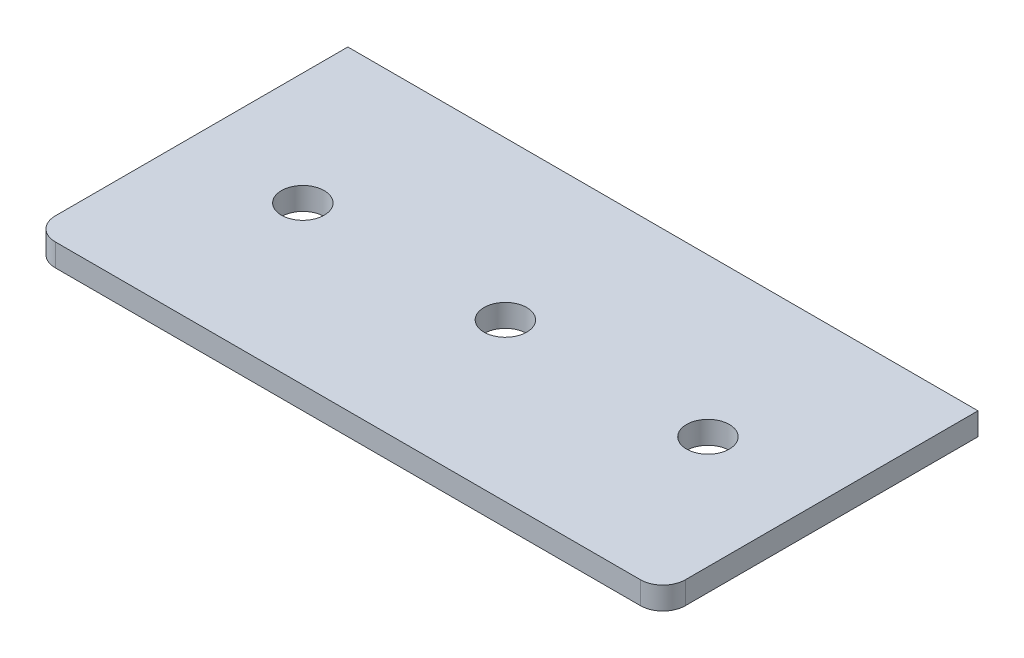
ISO-10303-21;
HEADER;
FILE_DESCRIPTION(('STEP AP214'),'2;1');
FILE_NAME('part.step','',(''),(''),'','','');
FILE_SCHEMA(('AUTOMOTIVE_DESIGN { 1 0 10303 214 1 1 1 1 }'));
ENDSEC;
DATA;
#1=APPLICATION_CONTEXT('core data for automotive mechanical design processes');
#2=APPLICATION_PROTOCOL_DEFINITION('international standard','automotive_design',2000,#1);
#3=PRODUCT_CONTEXT('',#1,'mechanical');
#4=PRODUCT('Part','Part','',(#3));
#5=PRODUCT_RELATED_PRODUCT_CATEGORY('part','',(#4));
#6=PRODUCT_DEFINITION_FORMATION('','',#4);
#7=PRODUCT_DEFINITION_CONTEXT('part definition',#1,'design');
#8=PRODUCT_DEFINITION('design','',#6,#7);
#9=PRODUCT_DEFINITION_SHAPE('','',#8);
#10=(LENGTH_UNIT() NAMED_UNIT(*) SI_UNIT(.MILLI.,.METRE.));
#11=(NAMED_UNIT(*) PLANE_ANGLE_UNIT() SI_UNIT($,.RADIAN.));
#12=(NAMED_UNIT(*) SI_UNIT($,.STERADIAN.) SOLID_ANGLE_UNIT());
#13=UNCERTAINTY_MEASURE_WITH_UNIT(LENGTH_MEASURE(1.E-05),#10,'distance_accuracy_value','');
#14=(GEOMETRIC_REPRESENTATION_CONTEXT(3) GLOBAL_UNCERTAINTY_ASSIGNED_CONTEXT((#13)) GLOBAL_UNIT_ASSIGNED_CONTEXT((#10,
#11,#12)) REPRESENTATION_CONTEXT('',''));
#15=CARTESIAN_POINT('',(0.,0.,0.));
#16=DIRECTION('',(0.,0.,1.));
#17=DIRECTION('',(1.,0.,0.));
#18=AXIS2_PLACEMENT_3D('',#15,#16,#17);
#19=CARTESIAN_POINT('',(0.,10.,0.));
#20=DIRECTION('',(0.,-1.,0.));
#21=DIRECTION('',(0.,0.,-1.));
#22=AXIS2_PLACEMENT_3D('',#19,#20,#21);
#23=PLANE('',#22);
#24=CARTESIAN_POINT('',(-90.,10.,0.));
#25=DIRECTION('',(0.,1.,0.));
#26=DIRECTION('',(0.,0.,1.));
#27=AXIS2_PLACEMENT_3D('',#24,#25,#26);
#28=CIRCLE('',#27,9.49999999999999);
#29=CARTESIAN_POINT('',(-90.,10.,9.49999999999998));
#30=VERTEX_POINT('',#29);
#31=EDGE_CURVE('E154',#30,#30,#28,.T.);
#32=ORIENTED_EDGE('',*,*,#31,.F.);
#33=EDGE_LOOP('',(#32));
#34=FACE_BOUND('',#33,.T.);
#35=CARTESIAN_POINT('',(0.,10.,0.));
#36=DIRECTION('',(0.,1.,0.));
#37=DIRECTION('',(0.,0.,1.));
#38=AXIS2_PLACEMENT_3D('',#35,#36,#37);
#39=CIRCLE('',#38,9.5);
#40=CARTESIAN_POINT('',(0.,10.,9.5));
#41=VERTEX_POINT('',#40);
#42=EDGE_CURVE('E147',#41,#41,#39,.T.);
#43=ORIENTED_EDGE('',*,*,#42,.F.);
#44=EDGE_LOOP('',(#43));
#45=FACE_BOUND('',#44,.T.);
#46=DIRECTION('',(1.,0.,0.));
#47=VECTOR('',#46,1.);
#48=CARTESIAN_POINT('',(-140.,10.,70.));
#49=LINE('',#48,#47);
#50=CARTESIAN_POINT('',(-130.,10.,70.));
#51=VERTEX_POINT('',#50);
#52=CARTESIAN_POINT('',(130.,10.,70.));
#53=VERTEX_POINT('',#52);
#54=EDGE_CURVE('E116',#51,#53,#49,.T.);
#55=ORIENTED_EDGE('',*,*,#54,.T.);
#56=CARTESIAN_POINT('',(130.,10.,60.));
#57=DIRECTION('',(0.,-1.,0.));
#58=DIRECTION('',(0.,0.,-1.));
#59=AXIS2_PLACEMENT_3D('',#56,#57,#58);
#60=CIRCLE('',#59,10.);
#61=CARTESIAN_POINT('',(140.,10.,60.));
#62=VERTEX_POINT('',#61);
#63=EDGE_CURVE('E42',#53,#62,#60,.F.);
#64=ORIENTED_EDGE('',*,*,#63,.T.);
#65=DIRECTION('',(0.,0.,-1.));
#66=VECTOR('',#65,1.);
#67=CARTESIAN_POINT('',(140.,10.,70.));
#68=LINE('',#67,#66);
#69=CARTESIAN_POINT('',(140.,10.,-70.));
#70=VERTEX_POINT('',#69);
#71=EDGE_CURVE('E88',#62,#70,#68,.T.);
#72=ORIENTED_EDGE('',*,*,#71,.T.);
#73=DIRECTION('',(-1.,0.,0.));
#74=VECTOR('',#73,1.);
#75=CARTESIAN_POINT('',(-140.,10.,-70.));
#76=LINE('',#75,#74);
#77=CARTESIAN_POINT('',(-140.,10.,-70.));
#78=VERTEX_POINT('',#77);
#79=EDGE_CURVE('E91',#70,#78,#76,.T.);
#80=ORIENTED_EDGE('',*,*,#79,.T.);
#81=DIRECTION('',(0.,0.,1.));
#82=VECTOR('',#81,1.);
#83=CARTESIAN_POINT('',(-140.,10.,70.));
#84=LINE('',#83,#82);
#85=CARTESIAN_POINT('',(-140.,10.,60.));
#86=VERTEX_POINT('',#85);
#87=EDGE_CURVE('E106',#78,#86,#84,.T.);
#88=ORIENTED_EDGE('',*,*,#87,.T.);
#89=CARTESIAN_POINT('',(-130.,10.,60.));
#90=DIRECTION('',(0.,-1.,0.));
#91=DIRECTION('',(0.,0.,-1.));
#92=AXIS2_PLACEMENT_3D('',#89,#90,#91);
#93=CIRCLE('',#92,10.);
#94=EDGE_CURVE('E127',#86,#51,#93,.F.);
#95=ORIENTED_EDGE('',*,*,#94,.T.);
#96=EDGE_LOOP('',(#55,#64,#72,#80,#88,#95));
#97=FACE_BOUND('',#96,.T.);
#98=CARTESIAN_POINT('',(90.,10.,0.));
#99=DIRECTION('',(0.,-1.,0.));
#100=DIRECTION('',(0.,0.,1.));
#101=AXIS2_PLACEMENT_3D('',#98,#99,#100);
#102=CIRCLE('',#101,9.49999999999999);
#103=CARTESIAN_POINT('',(90.,10.,9.49999999999998));
#104=VERTEX_POINT('',#103);
#105=EDGE_CURVE('E159',#104,#104,#102,.T.);
#106=ORIENTED_EDGE('',*,*,#105,.T.);
#107=EDGE_LOOP('',(#106));
#108=FACE_BOUND('',#107,.T.);
#109=ADVANCED_FACE('F34',(#34,#45,#97,#108),#23,.F.);
#110=CARTESIAN_POINT('',(0.,0.,0.));
#111=DIRECTION('',(0.,-1.,0.));
#112=DIRECTION('',(0.,0.,-1.));
#113=AXIS2_PLACEMENT_3D('',#110,#111,#112);
#114=PLANE('',#113);
#115=DIRECTION('',(0.,0.,-1.));
#116=VECTOR('',#115,1.);
#117=CARTESIAN_POINT('',(140.,0.,70.));
#118=LINE('',#117,#116);
#119=CARTESIAN_POINT('',(140.,0.,60.));
#120=VERTEX_POINT('',#119);
#121=CARTESIAN_POINT('',(140.,0.,-70.));
#122=VERTEX_POINT('',#121);
#123=EDGE_CURVE('E110',#120,#122,#118,.T.);
#124=ORIENTED_EDGE('',*,*,#123,.F.);
#125=CARTESIAN_POINT('',(130.,0.,60.));
#126=DIRECTION('',(0.,-1.,0.));
#127=DIRECTION('',(0.,0.,-1.));
#128=AXIS2_PLACEMENT_3D('',#125,#126,#127);
#129=CIRCLE('',#128,10.);
#130=CARTESIAN_POINT('',(130.,0.,70.));
#131=VERTEX_POINT('',#130);
#132=EDGE_CURVE('E121',#120,#131,#129,.T.);
#133=ORIENTED_EDGE('',*,*,#132,.T.);
#134=DIRECTION('',(1.,0.,0.));
#135=VECTOR('',#134,1.);
#136=CARTESIAN_POINT('',(-140.,0.,70.));
#137=LINE('',#136,#135);
#138=CARTESIAN_POINT('',(-130.,0.,70.));
#139=VERTEX_POINT('',#138);
#140=EDGE_CURVE('E98',#139,#131,#137,.T.);
#141=ORIENTED_EDGE('',*,*,#140,.F.);
#142=CARTESIAN_POINT('',(-130.,0.,60.));
#143=DIRECTION('',(0.,-1.,0.));
#144=DIRECTION('',(0.,0.,-1.));
#145=AXIS2_PLACEMENT_3D('',#142,#143,#144);
#146=CIRCLE('',#145,10.);
#147=CARTESIAN_POINT('',(-140.,0.,60.));
#148=VERTEX_POINT('',#147);
#149=EDGE_CURVE('E114',#139,#148,#146,.T.);
#150=ORIENTED_EDGE('',*,*,#149,.T.);
#151=DIRECTION('',(0.,0.,1.));
#152=VECTOR('',#151,1.);
#153=CARTESIAN_POINT('',(-140.,0.,70.));
#154=LINE('',#153,#152);
#155=CARTESIAN_POINT('',(-140.,0.,-70.));
#156=VERTEX_POINT('',#155);
#157=EDGE_CURVE('E138',#156,#148,#154,.T.);
#158=ORIENTED_EDGE('',*,*,#157,.F.);
#159=DIRECTION('',(-1.,0.,0.));
#160=VECTOR('',#159,1.);
#161=CARTESIAN_POINT('',(-140.,0.,-70.));
#162=LINE('',#161,#160);
#163=EDGE_CURVE('E140',#122,#156,#162,.T.);
#164=ORIENTED_EDGE('',*,*,#163,.F.);
#165=EDGE_LOOP('',(#124,#133,#141,#150,#158,#164));
#166=FACE_BOUND('',#165,.T.);
#167=CARTESIAN_POINT('',(0.,0.,0.));
#168=DIRECTION('',(0.,1.,0.));
#169=DIRECTION('',(0.,0.,1.));
#170=AXIS2_PLACEMENT_3D('',#167,#168,#169);
#171=CIRCLE('',#170,9.5);
#172=CARTESIAN_POINT('',(0.,0.,9.5));
#173=VERTEX_POINT('',#172);
#174=EDGE_CURVE('E150',#173,#173,#171,.T.);
#175=ORIENTED_EDGE('',*,*,#174,.T.);
#176=EDGE_LOOP('',(#175));
#177=FACE_BOUND('',#176,.T.);
#178=CARTESIAN_POINT('',(-90.,0.,0.));
#179=DIRECTION('',(0.,1.,0.));
#180=DIRECTION('',(0.,0.,1.));
#181=AXIS2_PLACEMENT_3D('',#178,#179,#180);
#182=CIRCLE('',#181,9.49999999999999);
#183=CARTESIAN_POINT('',(-90.,0.,9.49999999999998));
#184=VERTEX_POINT('',#183);
#185=EDGE_CURVE('E144',#184,#184,#182,.T.);
#186=ORIENTED_EDGE('',*,*,#185,.T.);
#187=EDGE_LOOP('',(#186));
#188=FACE_BOUND('',#187,.T.);
#189=CARTESIAN_POINT('',(90.,0.,0.));
#190=DIRECTION('',(0.,-1.,0.));
#191=DIRECTION('',(0.,0.,1.));
#192=AXIS2_PLACEMENT_3D('',#189,#190,#191);
#193=CIRCLE('',#192,9.49999999999999);
#194=CARTESIAN_POINT('',(90.,0.,9.49999999999998));
#195=VERTEX_POINT('',#194);
#196=EDGE_CURVE('E151',#195,#195,#193,.T.);
#197=ORIENTED_EDGE('',*,*,#196,.F.);
#198=EDGE_LOOP('',(#197));
#199=FACE_BOUND('',#198,.T.);
#200=ADVANCED_FACE('F136',(#166,#177,#188,#199),#114,.T.);
#201=CARTESIAN_POINT('',(140.,10.,70.));
#202=DIRECTION('',(-1.,0.,0.));
#203=DIRECTION('',(0.,0.,1.));
#204=AXIS2_PLACEMENT_3D('',#201,#202,#203);
#205=PLANE('',#204);
#206=ORIENTED_EDGE('',*,*,#71,.F.);
#207=DIRECTION('',(0.,-1.,0.));
#208=VECTOR('',#207,1.);
#209=CARTESIAN_POINT('',(140.,10.,60.));
#210=LINE('',#209,#208);
#211=EDGE_CURVE('E112',#62,#120,#210,.T.);
#212=ORIENTED_EDGE('',*,*,#211,.T.);
#213=ORIENTED_EDGE('',*,*,#123,.T.);
#214=DIRECTION('',(0.,-1.,0.));
#215=VECTOR('',#214,1.);
#216=CARTESIAN_POINT('',(140.,10.,-70.));
#217=LINE('',#216,#215);
#218=EDGE_CURVE('E103',#70,#122,#217,.T.);
#219=ORIENTED_EDGE('',*,*,#218,.F.);
#220=EDGE_LOOP('',(#206,#212,#213,#219));
#221=FACE_BOUND('',#220,.T.);
#222=ADVANCED_FACE('F108',(#221),#205,.F.);
#223=CARTESIAN_POINT('',(-140.,10.,-70.));
#224=DIRECTION('',(0.,0.,1.));
#225=DIRECTION('',(1.,0.,0.));
#226=AXIS2_PLACEMENT_3D('',#223,#224,#225);
#227=PLANE('',#226);
#228=ORIENTED_EDGE('',*,*,#163,.T.);
#229=DIRECTION('',(0.,-1.,0.));
#230=VECTOR('',#229,1.);
#231=CARTESIAN_POINT('',(-140.,10.,-70.));
#232=LINE('',#231,#230);
#233=EDGE_CURVE('E105',#78,#156,#232,.T.);
#234=ORIENTED_EDGE('',*,*,#233,.F.);
#235=ORIENTED_EDGE('',*,*,#79,.F.);
#236=ORIENTED_EDGE('',*,*,#218,.T.);
#237=EDGE_LOOP('',(#228,#234,#235,#236));
#238=FACE_BOUND('',#237,.T.);
#239=ADVANCED_FACE('F102',(#238),#227,.F.);
#240=CARTESIAN_POINT('',(-140.,10.,70.));
#241=DIRECTION('',(1.,0.,0.));
#242=DIRECTION('',(0.,0.,-1.));
#243=AXIS2_PLACEMENT_3D('',#240,#241,#242);
#244=PLANE('',#243);
#245=ORIENTED_EDGE('',*,*,#157,.T.);
#246=DIRECTION('',(0.,-1.,0.));
#247=VECTOR('',#246,1.);
#248=CARTESIAN_POINT('',(-140.,10.,60.));
#249=LINE('',#248,#247);
#250=EDGE_CURVE('E11',#148,#86,#249,.F.);
#251=ORIENTED_EDGE('',*,*,#250,.T.);
#252=ORIENTED_EDGE('',*,*,#87,.F.);
#253=ORIENTED_EDGE('',*,*,#233,.T.);
#254=EDGE_LOOP('',(#245,#251,#252,#253));
#255=FACE_BOUND('',#254,.T.);
#256=ADVANCED_FACE('F139',(#255),#244,.F.);
#257=CARTESIAN_POINT('',(-140.,10.,70.));
#258=DIRECTION('',(0.,0.,-1.));
#259=DIRECTION('',(-1.,0.,0.));
#260=AXIS2_PLACEMENT_3D('',#257,#258,#259);
#261=PLANE('',#260);
#262=ORIENTED_EDGE('',*,*,#140,.T.);
#263=DIRECTION('',(0.,-1.,0.));
#264=VECTOR('',#263,1.);
#265=CARTESIAN_POINT('',(130.,10.,70.));
#266=LINE('',#265,#264);
#267=EDGE_CURVE('E55',#131,#53,#266,.F.);
#268=ORIENTED_EDGE('',*,*,#267,.T.);
#269=ORIENTED_EDGE('',*,*,#54,.F.);
#270=DIRECTION('',(0.,-1.,0.));
#271=VECTOR('',#270,1.);
#272=CARTESIAN_POINT('',(-130.,10.,70.));
#273=LINE('',#272,#271);
#274=EDGE_CURVE('E123',#51,#139,#273,.T.);
#275=ORIENTED_EDGE('',*,*,#274,.T.);
#276=EDGE_LOOP('',(#262,#268,#269,#275));
#277=FACE_BOUND('',#276,.T.);
#278=ADVANCED_FACE('F131',(#277),#261,.F.);
#279=CARTESIAN_POINT('',(0.,0.,0.));
#280=DIRECTION('',(0.,1.,0.));
#281=DIRECTION('',(0.,0.,1.));
#282=AXIS2_PLACEMENT_3D('',#279,#280,#281);
#283=CYLINDRICAL_SURFACE('',#282,9.5);
#284=ORIENTED_EDGE('',*,*,#174,.F.);
#285=EDGE_LOOP('',(#284));
#286=FACE_BOUND('',#285,.T.);
#287=ORIENTED_EDGE('',*,*,#42,.T.);
#288=EDGE_LOOP('',(#287));
#289=FACE_BOUND('',#288,.T.);
#290=ADVANCED_FACE('F181',(#286,#289),#283,.F.);
#291=CARTESIAN_POINT('',(-90.,0.,0.));
#292=DIRECTION('',(0.,1.,0.));
#293=DIRECTION('',(0.,0.,1.));
#294=AXIS2_PLACEMENT_3D('',#291,#292,#293);
#295=CYLINDRICAL_SURFACE('',#294,9.49999999999999);
#296=ORIENTED_EDGE('',*,*,#185,.F.);
#297=EDGE_LOOP('',(#296));
#298=FACE_BOUND('',#297,.T.);
#299=ORIENTED_EDGE('',*,*,#31,.T.);
#300=EDGE_LOOP('',(#299));
#301=FACE_BOUND('',#300,.T.);
#302=ADVANCED_FACE('F192',(#298,#301),#295,.F.);
#303=CARTESIAN_POINT('',(90.,0.,0.));
#304=DIRECTION('',(0.,1.,0.));
#305=DIRECTION('',(0.,0.,1.));
#306=AXIS2_PLACEMENT_3D('',#303,#304,#305);
#307=CYLINDRICAL_SURFACE('',#306,9.49999999999999);
#308=ORIENTED_EDGE('',*,*,#196,.T.);
#309=EDGE_LOOP('',(#308));
#310=FACE_BOUND('',#309,.T.);
#311=ORIENTED_EDGE('',*,*,#105,.F.);
#312=EDGE_LOOP('',(#311));
#313=FACE_BOUND('',#312,.T.);
#314=ADVANCED_FACE('F165',(#310,#313),#307,.F.);
#315=CARTESIAN_POINT('',(130.,10.,60.));
#316=DIRECTION('',(0.,-1.,0.));
#317=DIRECTION('',(0.,0.,-1.));
#318=AXIS2_PLACEMENT_3D('',#315,#316,#317);
#319=CYLINDRICAL_SURFACE('',#318,10.);
#320=ORIENTED_EDGE('',*,*,#63,.F.);
#321=ORIENTED_EDGE('',*,*,#267,.F.);
#322=ORIENTED_EDGE('',*,*,#132,.F.);
#323=ORIENTED_EDGE('',*,*,#211,.F.);
#324=EDGE_LOOP('',(#320,#321,#322,#323));
#325=FACE_BOUND('',#324,.T.);
#326=ADVANCED_FACE('F185',(#325),#319,.T.);
#327=CARTESIAN_POINT('',(-130.,10.,60.));
#328=DIRECTION('',(0.,-1.,0.));
#329=DIRECTION('',(0.,0.,-1.));
#330=AXIS2_PLACEMENT_3D('',#327,#328,#329);
#331=CYLINDRICAL_SURFACE('',#330,10.);
#332=ORIENTED_EDGE('',*,*,#94,.F.);
#333=ORIENTED_EDGE('',*,*,#250,.F.);
#334=ORIENTED_EDGE('',*,*,#149,.F.);
#335=ORIENTED_EDGE('',*,*,#274,.F.);
#336=EDGE_LOOP('',(#332,#333,#334,#335));
#337=FACE_BOUND('',#336,.T.);
#338=ADVANCED_FACE('F36',(#337),#331,.T.);
#339=CLOSED_SHELL('',(#109,#200,#222,#239,#256,#278,#290,#302,#314,#326,#338));
#340=MANIFOLD_SOLID_BREP('B2',#339);
#341=ADVANCED_BREP_SHAPE_REPRESENTATION('',(#18,#340),#14);
#342=SHAPE_DEFINITION_REPRESENTATION(#9,#341);
ENDSEC;
END-ISO-10303-21;
